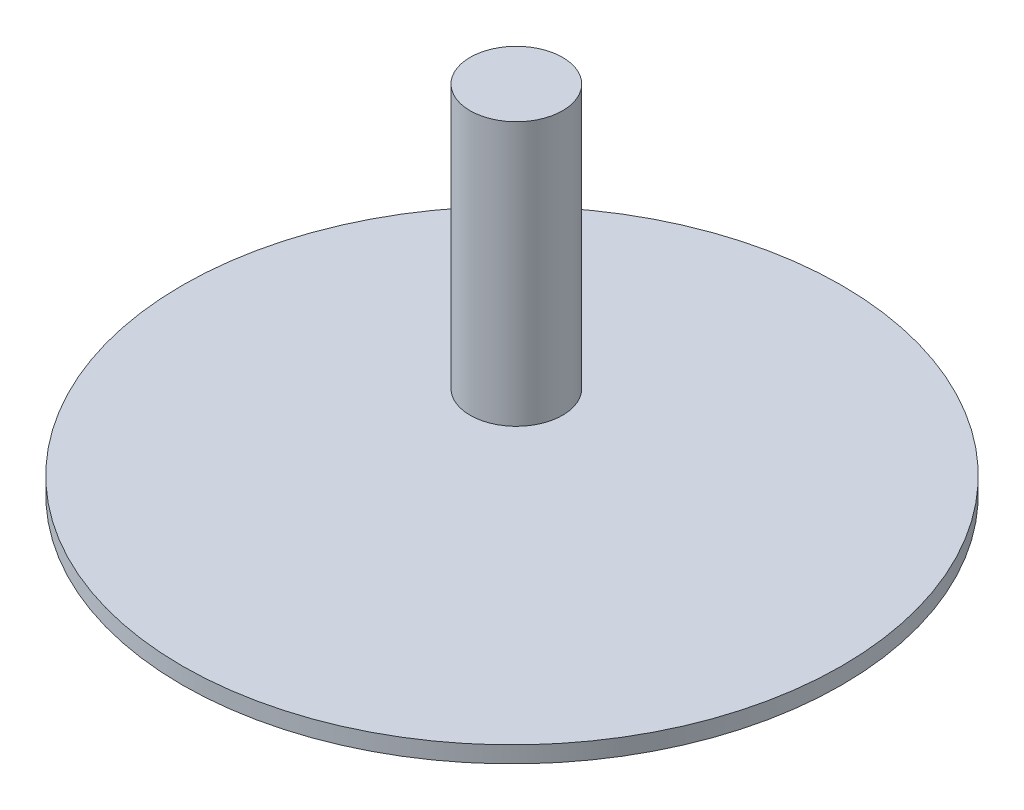
ISO-10303-21;
HEADER;
FILE_DESCRIPTION(('STEP AP214'),'2;1');
FILE_NAME('part.step','',(''),(''),'','','');
FILE_SCHEMA(('AUTOMOTIVE_DESIGN { 1 0 10303 214 1 1 1 1 }'));
ENDSEC;
DATA;
#1=APPLICATION_CONTEXT('core data for automotive mechanical design processes');
#2=APPLICATION_PROTOCOL_DEFINITION('international standard','automotive_design',2000,#1);
#3=PRODUCT_CONTEXT('',#1,'mechanical');
#4=PRODUCT('Part','Part','',(#3));
#5=PRODUCT_RELATED_PRODUCT_CATEGORY('part','',(#4));
#6=PRODUCT_DEFINITION_FORMATION('','',#4);
#7=PRODUCT_DEFINITION_CONTEXT('part definition',#1,'design');
#8=PRODUCT_DEFINITION('design','',#6,#7);
#9=PRODUCT_DEFINITION_SHAPE('','',#8);
#10=(LENGTH_UNIT() NAMED_UNIT(*) SI_UNIT(.MILLI.,.METRE.));
#11=(NAMED_UNIT(*) PLANE_ANGLE_UNIT() SI_UNIT($,.RADIAN.));
#12=(NAMED_UNIT(*) SI_UNIT($,.STERADIAN.) SOLID_ANGLE_UNIT());
#13=UNCERTAINTY_MEASURE_WITH_UNIT(LENGTH_MEASURE(1.E-05),#10,'distance_accuracy_value','');
#14=(GEOMETRIC_REPRESENTATION_CONTEXT(3) GLOBAL_UNCERTAINTY_ASSIGNED_CONTEXT((#13)) GLOBAL_UNIT_ASSIGNED_CONTEXT((#10,
#11,#12)) REPRESENTATION_CONTEXT('',''));
#15=CARTESIAN_POINT('',(0.,0.,0.));
#16=DIRECTION('',(0.,0.,1.));
#17=DIRECTION('',(1.,0.,0.));
#18=AXIS2_PLACEMENT_3D('',#15,#16,#17);
#19=CARTESIAN_POINT('',(0.,5.08,0.));
#20=DIRECTION('',(0.,-1.,0.));
#21=DIRECTION('',(0.,0.,-1.));
#22=AXIS2_PLACEMENT_3D('',#19,#20,#21);
#23=CYLINDRICAL_SURFACE('',#22,101.6);
#24=CARTESIAN_POINT('',(0.,5.08,0.));
#25=DIRECTION('',(0.,1.,0.));
#26=DIRECTION('',(0.,0.,1.));
#27=AXIS2_PLACEMENT_3D('',#24,#25,#26);
#28=CIRCLE('',#27,101.6);
#29=CARTESIAN_POINT('',(0.,5.08,101.6));
#30=VERTEX_POINT('',#29);
#31=EDGE_CURVE('E10',#30,#30,#28,.T.);
#32=ORIENTED_EDGE('',*,*,#31,.F.);
#33=EDGE_LOOP('',(#32));
#34=FACE_BOUND('',#33,.T.);
#35=CARTESIAN_POINT('',(0.,0.,0.));
#36=DIRECTION('',(0.,1.,0.));
#37=DIRECTION('',(0.,0.,1.));
#38=AXIS2_PLACEMENT_3D('',#35,#36,#37);
#39=CIRCLE('',#38,101.6);
#40=CARTESIAN_POINT('',(0.,0.,101.6));
#41=VERTEX_POINT('',#40);
#42=EDGE_CURVE('E34',#41,#41,#39,.T.);
#43=ORIENTED_EDGE('',*,*,#42,.T.);
#44=EDGE_LOOP('',(#43));
#45=FACE_BOUND('',#44,.T.);
#46=ADVANCED_FACE('F31',(#34,#45),#23,.T.);
#47=CARTESIAN_POINT('',(0.,5.08,0.));
#48=DIRECTION('',(0.,1.,0.));
#49=DIRECTION('',(0.,0.,1.));
#50=AXIS2_PLACEMENT_3D('',#47,#48,#49);
#51=PLANE('',#50);
#52=CARTESIAN_POINT('',(-22.5650291737249,5.08,-23.9081856721611));
#53=DIRECTION('',(0.,1.,0.));
#54=DIRECTION('',(0.,0.,1.));
#55=AXIS2_PLACEMENT_3D('',#52,#53,#54);
#56=CIRCLE('',#55,14.25);
#57=CARTESIAN_POINT('',(-22.5650291737249,5.08,-9.6581856721611));
#58=VERTEX_POINT('',#57);
#59=EDGE_CURVE('E43',#58,#58,#56,.T.);
#60=ORIENTED_EDGE('',*,*,#59,.F.);
#61=EDGE_LOOP('',(#60));
#62=FACE_BOUND('',#61,.T.);
#63=ORIENTED_EDGE('',*,*,#31,.T.);
#64=EDGE_LOOP('',(#63));
#65=FACE_BOUND('',#64,.T.);
#66=ADVANCED_FACE('F58',(#62,#65),#51,.T.);
#67=CARTESIAN_POINT('',(0.,0.,0.));
#68=DIRECTION('',(0.,1.,0.));
#69=DIRECTION('',(0.,0.,1.));
#70=AXIS2_PLACEMENT_3D('',#67,#68,#69);
#71=PLANE('',#70);
#72=ORIENTED_EDGE('',*,*,#42,.F.);
#73=EDGE_LOOP('',(#72));
#74=FACE_BOUND('',#73,.T.);
#75=ADVANCED_FACE('F54',(#74),#71,.F.);
#76=CARTESIAN_POINT('',(-22.5650291737249,86.36,-23.9081856721611));
#77=DIRECTION('',(0.,-1.,0.));
#78=DIRECTION('',(0.,0.,-1.));
#79=AXIS2_PLACEMENT_3D('',#76,#77,#78);
#80=CYLINDRICAL_SURFACE('',#79,14.25);
#81=CARTESIAN_POINT('',(-22.5650291737249,86.36,-23.9081856721611));
#82=DIRECTION('',(0.,1.,0.));
#83=DIRECTION('',(0.,0.,1.));
#84=AXIS2_PLACEMENT_3D('',#81,#82,#83);
#85=CIRCLE('',#84,14.25);
#86=CARTESIAN_POINT('',(-22.5650291737249,86.36,-9.6581856721611));
#87=VERTEX_POINT('',#86);
#88=EDGE_CURVE('E41',#87,#87,#85,.T.);
#89=ORIENTED_EDGE('',*,*,#88,.F.);
#90=EDGE_LOOP('',(#89));
#91=FACE_BOUND('',#90,.T.);
#92=ORIENTED_EDGE('',*,*,#59,.T.);
#93=EDGE_LOOP('',(#92));
#94=FACE_BOUND('',#93,.T.);
#95=ADVANCED_FACE('F51',(#91,#94),#80,.T.);
#96=CARTESIAN_POINT('',(-22.5650291737249,86.36,-23.9081856721611));
#97=DIRECTION('',(0.,1.,0.));
#98=DIRECTION('',(0.,0.,1.));
#99=AXIS2_PLACEMENT_3D('',#96,#97,#98);
#100=PLANE('',#99);
#101=ORIENTED_EDGE('',*,*,#88,.T.);
#102=EDGE_LOOP('',(#101));
#103=FACE_BOUND('',#102,.T.);
#104=ADVANCED_FACE('F49',(#103),#100,.T.);
#105=CLOSED_SHELL('',(#46,#66,#75,#95,#104));
#106=MANIFOLD_SOLID_BREP('B2',#105);
#107=ADVANCED_BREP_SHAPE_REPRESENTATION('',(#18,#106),#14);
#108=SHAPE_DEFINITION_REPRESENTATION(#9,#107);
ENDSEC;
END-ISO-10303-21;
